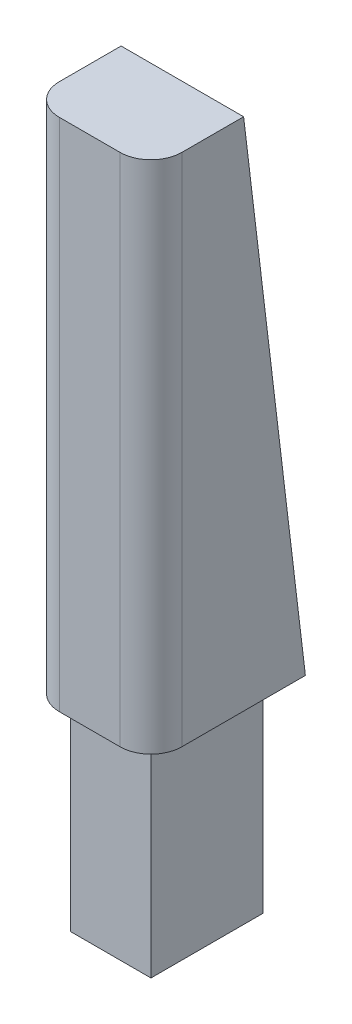
ISO-10303-21;
HEADER;
FILE_DESCRIPTION(('STEP AP214'),'2;1');
FILE_NAME('part.step','',(''),(''),'','','');
FILE_SCHEMA(('AUTOMOTIVE_DESIGN { 1 0 10303 214 1 1 1 1 }'));
ENDSEC;
DATA;
#1=APPLICATION_CONTEXT('core data for automotive mechanical design processes');
#2=APPLICATION_PROTOCOL_DEFINITION('international standard','automotive_design',2000,#1);
#3=PRODUCT_CONTEXT('',#1,'mechanical');
#4=PRODUCT('Part','Part','',(#3));
#5=PRODUCT_RELATED_PRODUCT_CATEGORY('part','',(#4));
#6=PRODUCT_DEFINITION_FORMATION('','',#4);
#7=PRODUCT_DEFINITION_CONTEXT('part definition',#1,'design');
#8=PRODUCT_DEFINITION('design','',#6,#7);
#9=PRODUCT_DEFINITION_SHAPE('','',#8);
#10=(LENGTH_UNIT() NAMED_UNIT(*) SI_UNIT(.MILLI.,.METRE.));
#11=(NAMED_UNIT(*) PLANE_ANGLE_UNIT() SI_UNIT($,.RADIAN.));
#12=(NAMED_UNIT(*) SI_UNIT($,.STERADIAN.) SOLID_ANGLE_UNIT());
#13=UNCERTAINTY_MEASURE_WITH_UNIT(LENGTH_MEASURE(1.E-05),#10,'distance_accuracy_value','');
#14=(GEOMETRIC_REPRESENTATION_CONTEXT(3) GLOBAL_UNCERTAINTY_ASSIGNED_CONTEXT((#13)) GLOBAL_UNIT_ASSIGNED_CONTEXT((#10,
#11,#12)) REPRESENTATION_CONTEXT('',''));
#15=CARTESIAN_POINT('',(0.,0.,0.));
#16=DIRECTION('',(0.,0.,1.));
#17=DIRECTION('',(1.,0.,0.));
#18=AXIS2_PLACEMENT_3D('',#15,#16,#17);
#19=CARTESIAN_POINT('',(3.9,20.,5.45));
#20=DIRECTION('',(-1.,0.,0.));
#21=DIRECTION('',(0.,0.,1.));
#22=AXIS2_PLACEMENT_3D('',#19,#20,#21);
#23=PLANE('',#22);
#24=DIRECTION('',(0.,0.,-1.));
#25=VECTOR('',#24,1.);
#26=CARTESIAN_POINT('',(3.9,0.,5.45));
#27=LINE('',#26,#25);
#28=CARTESIAN_POINT('',(3.9,0.,5.45));
#29=VERTEX_POINT('',#28);
#30=CARTESIAN_POINT('',(3.9,0.,-5.45));
#31=VERTEX_POINT('',#30);
#32=EDGE_CURVE('E162',#29,#31,#27,.T.);
#33=ORIENTED_EDGE('',*,*,#32,.T.);
#34=DIRECTION('',(0.,-1.,0.));
#35=VECTOR('',#34,1.);
#36=CARTESIAN_POINT('',(3.9,20.,-5.45));
#37=LINE('',#36,#35);
#38=CARTESIAN_POINT('',(3.9,20.,-5.45));
#39=VERTEX_POINT('',#38);
#40=EDGE_CURVE('E209',#39,#31,#37,.T.);
#41=ORIENTED_EDGE('',*,*,#40,.F.);
#42=DIRECTION('',(0.,0.,-1.));
#43=VECTOR('',#42,1.);
#44=CARTESIAN_POINT('',(3.9,20.,5.45));
#45=LINE('',#44,#43);
#46=CARTESIAN_POINT('',(3.9,20.,5.45));
#47=VERTEX_POINT('',#46);
#48=EDGE_CURVE('E169',#47,#39,#45,.T.);
#49=ORIENTED_EDGE('',*,*,#48,.F.);
#50=DIRECTION('',(0.,-1.,0.));
#51=VECTOR('',#50,1.);
#52=CARTESIAN_POINT('',(3.9,20.,5.45));
#53=LINE('',#52,#51);
#54=EDGE_CURVE('E186',#47,#29,#53,.T.);
#55=ORIENTED_EDGE('',*,*,#54,.T.);
#56=EDGE_LOOP('',(#33,#41,#49,#55));
#57=FACE_BOUND('',#56,.T.);
#58=ADVANCED_FACE('F45',(#57),#23,.F.);
#59=CARTESIAN_POINT('',(-3.9,20.,-5.45));
#60=DIRECTION('',(0.,0.,1.));
#61=DIRECTION('',(1.,0.,0.));
#62=AXIS2_PLACEMENT_3D('',#59,#60,#61);
#63=PLANE('',#62);
#64=DIRECTION('',(-1.,0.,0.));
#65=VECTOR('',#64,1.);
#66=CARTESIAN_POINT('',(-3.9,0.,-5.45));
#67=LINE('',#66,#65);
#68=CARTESIAN_POINT('',(-3.9,0.,-5.45));
#69=VERTEX_POINT('',#68);
#70=EDGE_CURVE('E190',#31,#69,#67,.T.);
#71=ORIENTED_EDGE('',*,*,#70,.T.);
#72=DIRECTION('',(0.,-1.,0.));
#73=VECTOR('',#72,1.);
#74=CARTESIAN_POINT('',(-3.9,20.,-5.45));
#75=LINE('',#74,#73);
#76=CARTESIAN_POINT('',(-3.9,20.,-5.45));
#77=VERTEX_POINT('',#76);
#78=EDGE_CURVE('E205',#77,#69,#75,.T.);
#79=ORIENTED_EDGE('',*,*,#78,.F.);
#80=DIRECTION('',(-1.,0.,0.));
#81=VECTOR('',#80,1.);
#82=CARTESIAN_POINT('',(-3.9,20.,-5.45));
#83=LINE('',#82,#81);
#84=EDGE_CURVE('E173',#39,#77,#83,.T.);
#85=ORIENTED_EDGE('',*,*,#84,.F.);
#86=ORIENTED_EDGE('',*,*,#40,.T.);
#87=EDGE_LOOP('',(#71,#79,#85,#86));
#88=FACE_BOUND('',#87,.T.);
#89=ADVANCED_FACE('F258',(#88),#63,.F.);
#90=CARTESIAN_POINT('',(-3.9,20.,5.45));
#91=DIRECTION('',(1.,0.,0.));
#92=DIRECTION('',(0.,0.,-1.));
#93=AXIS2_PLACEMENT_3D('',#90,#91,#92);
#94=PLANE('',#93);
#95=DIRECTION('',(0.,0.,1.));
#96=VECTOR('',#95,1.);
#97=CARTESIAN_POINT('',(-3.9,0.,5.45));
#98=LINE('',#97,#96);
#99=CARTESIAN_POINT('',(-3.9,0.,5.45));
#100=VERTEX_POINT('',#99);
#101=EDGE_CURVE('E193',#69,#100,#98,.T.);
#102=ORIENTED_EDGE('',*,*,#101,.T.);
#103=DIRECTION('',(0.,-1.,0.));
#104=VECTOR('',#103,1.);
#105=CARTESIAN_POINT('',(-3.9,20.,5.45));
#106=LINE('',#105,#104);
#107=CARTESIAN_POINT('',(-3.9,20.,5.45));
#108=VERTEX_POINT('',#107);
#109=EDGE_CURVE('E201',#108,#100,#106,.T.);
#110=ORIENTED_EDGE('',*,*,#109,.F.);
#111=DIRECTION('',(0.,0.,1.));
#112=VECTOR('',#111,1.);
#113=CARTESIAN_POINT('',(-3.9,20.,5.45));
#114=LINE('',#113,#112);
#115=EDGE_CURVE('E178',#77,#108,#114,.T.);
#116=ORIENTED_EDGE('',*,*,#115,.F.);
#117=ORIENTED_EDGE('',*,*,#78,.T.);
#118=EDGE_LOOP('',(#102,#110,#116,#117));
#119=FACE_BOUND('',#118,.T.);
#120=ADVANCED_FACE('F265',(#119),#94,.F.);
#121=CARTESIAN_POINT('',(-3.9,20.,5.45));
#122=DIRECTION('',(0.,0.,-1.));
#123=DIRECTION('',(-1.,0.,0.));
#124=AXIS2_PLACEMENT_3D('',#121,#122,#123);
#125=PLANE('',#124);
#126=DIRECTION('',(1.,0.,0.));
#127=VECTOR('',#126,1.);
#128=CARTESIAN_POINT('',(-3.9,0.,5.45));
#129=LINE('',#128,#127);
#130=EDGE_CURVE('E174',#100,#29,#129,.T.);
#131=ORIENTED_EDGE('',*,*,#130,.T.);
#132=ORIENTED_EDGE('',*,*,#54,.F.);
#133=DIRECTION('',(1.,0.,0.));
#134=VECTOR('',#133,1.);
#135=CARTESIAN_POINT('',(-3.9,20.,5.45));
#136=LINE('',#135,#134);
#137=EDGE_CURVE('E182',#108,#47,#136,.T.);
#138=ORIENTED_EDGE('',*,*,#137,.F.);
#139=ORIENTED_EDGE('',*,*,#109,.T.);
#140=EDGE_LOOP('',(#131,#132,#138,#139));
#141=FACE_BOUND('',#140,.T.);
#142=ADVANCED_FACE('F330',(#141),#125,.F.);
#143=CARTESIAN_POINT('',(0.,0.,0.));
#144=DIRECTION('',(0.,-1.,0.));
#145=DIRECTION('',(0.,0.,-1.));
#146=AXIS2_PLACEMENT_3D('',#143,#144,#145);
#147=PLANE('',#146);
#148=ORIENTED_EDGE('',*,*,#32,.F.);
#149=ORIENTED_EDGE('',*,*,#130,.F.);
#150=ORIENTED_EDGE('',*,*,#101,.F.);
#151=ORIENTED_EDGE('',*,*,#70,.F.);
#152=EDGE_LOOP('',(#148,#149,#150,#151));
#153=FACE_BOUND('',#152,.T.);
#154=ADVANCED_FACE('F255',(#153),#147,.T.);
#155=CARTESIAN_POINT('',(5.95,70.,7.5));
#156=DIRECTION('',(-1.,0.,0.));
#157=DIRECTION('',(0.,0.,1.));
#158=AXIS2_PLACEMENT_3D('',#155,#156,#157);
#159=PLANE('',#158);
#160=DIRECTION('',(0.,0.,-1.));
#161=VECTOR('',#160,1.);
#162=CARTESIAN_POINT('',(5.95,70.,7.5));
#163=LINE('',#162,#161);
#164=CARTESIAN_POINT('',(5.95,70.,4.5));
#165=VERTEX_POINT('',#164);
#166=CARTESIAN_POINT('',(5.95,70.,-1.5));
#167=VERTEX_POINT('',#166);
#168=EDGE_CURVE('E125',#165,#167,#163,.T.);
#169=ORIENTED_EDGE('',*,*,#168,.F.);
#170=DIRECTION('',(0.,-1.,0.));
#171=VECTOR('',#170,1.);
#172=CARTESIAN_POINT('',(5.95,70.,4.5));
#173=LINE('',#172,#171);
#174=CARTESIAN_POINT('',(5.95,20.,4.5));
#175=VERTEX_POINT('',#174);
#176=EDGE_CURVE('E213',#165,#175,#173,.T.);
#177=ORIENTED_EDGE('',*,*,#176,.T.);
#178=DIRECTION('',(0.,0.,-1.));
#179=VECTOR('',#178,1.);
#180=CARTESIAN_POINT('',(5.95,20.,7.5));
#181=LINE('',#180,#179);
#182=CARTESIAN_POINT('',(5.95,20.,-7.5));
#183=VERTEX_POINT('',#182);
#184=EDGE_CURVE('E149',#175,#183,#181,.T.);
#185=ORIENTED_EDGE('',*,*,#184,.T.);
#186=DIRECTION('',(0.,0.992876838486922,0.119145220618431));
#187=VECTOR('',#186,1.);
#188=CARTESIAN_POINT('',(5.95,20.,-7.5));
#189=LINE('',#188,#187);
#190=EDGE_CURVE('E141',#183,#167,#189,.T.);
#191=ORIENTED_EDGE('',*,*,#190,.T.);
#192=EDGE_LOOP('',(#169,#177,#185,#191));
#193=FACE_BOUND('',#192,.T.);
#194=ADVANCED_FACE('F147',(#193),#159,.F.);
#195=CARTESIAN_POINT('',(-5.95,70.,7.5));
#196=DIRECTION('',(1.,0.,0.));
#197=DIRECTION('',(0.,0.,-1.));
#198=AXIS2_PLACEMENT_3D('',#195,#196,#197);
#199=PLANE('',#198);
#200=DIRECTION('',(0.,0.,1.));
#201=VECTOR('',#200,1.);
#202=CARTESIAN_POINT('',(-5.95,20.,7.5));
#203=LINE('',#202,#201);
#204=CARTESIAN_POINT('',(-5.95,20.,-7.5));
#205=VERTEX_POINT('',#204);
#206=CARTESIAN_POINT('',(-5.95,20.,4.5));
#207=VERTEX_POINT('',#206);
#208=EDGE_CURVE('E168',#205,#207,#203,.T.);
#209=ORIENTED_EDGE('',*,*,#208,.T.);
#210=DIRECTION('',(0.,-1.,0.));
#211=VECTOR('',#210,1.);
#212=CARTESIAN_POINT('',(-5.95,70.,4.5));
#213=LINE('',#212,#211);
#214=CARTESIAN_POINT('',(-5.95,70.,4.5));
#215=VERTEX_POINT('',#214);
#216=EDGE_CURVE('E11',#207,#215,#213,.F.);
#217=ORIENTED_EDGE('',*,*,#216,.T.);
#218=DIRECTION('',(0.,0.,1.));
#219=VECTOR('',#218,1.);
#220=CARTESIAN_POINT('',(-5.95,70.,7.5));
#221=LINE('',#220,#219);
#222=CARTESIAN_POINT('',(-5.95,70.,-1.5));
#223=VERTEX_POINT('',#222);
#224=EDGE_CURVE('E135',#223,#215,#221,.T.);
#225=ORIENTED_EDGE('',*,*,#224,.F.);
#226=DIRECTION('',(0.,-0.992876838486922,-0.119145220618431));
#227=VECTOR('',#226,1.);
#228=CARTESIAN_POINT('',(-5.95,71.0646687697161,-1.37223974763407));
#229=LINE('',#228,#227);
#230=EDGE_CURVE('E144',#223,#205,#229,.T.);
#231=ORIENTED_EDGE('',*,*,#230,.T.);
#232=EDGE_LOOP('',(#209,#217,#225,#231));
#233=FACE_BOUND('',#232,.T.);
#234=ADVANCED_FACE('F247',(#233),#199,.F.);
#235=CARTESIAN_POINT('',(-5.95,70.,7.5));
#236=DIRECTION('',(0.,0.,-1.));
#237=DIRECTION('',(-1.,0.,0.));
#238=AXIS2_PLACEMENT_3D('',#235,#236,#237);
#239=PLANE('',#238);
#240=DIRECTION('',(1.,0.,0.));
#241=VECTOR('',#240,1.);
#242=CARTESIAN_POINT('',(-5.95,20.,7.5));
#243=LINE('',#242,#241);
#244=CARTESIAN_POINT('',(-2.95,20.,7.5));
#245=VERTEX_POINT('',#244);
#246=CARTESIAN_POINT('',(2.95,20.,7.5));
#247=VERTEX_POINT('',#246);
#248=EDGE_CURVE('E136',#245,#247,#243,.T.);
#249=ORIENTED_EDGE('',*,*,#248,.T.);
#250=DIRECTION('',(0.,-1.,0.));
#251=VECTOR('',#250,1.);
#252=CARTESIAN_POINT('',(2.95,70.,7.5));
#253=LINE('',#252,#251);
#254=CARTESIAN_POINT('',(2.95,70.,7.5));
#255=VERTEX_POINT('',#254);
#256=EDGE_CURVE('E67',#247,#255,#253,.F.);
#257=ORIENTED_EDGE('',*,*,#256,.T.);
#258=DIRECTION('',(1.,0.,0.));
#259=VECTOR('',#258,1.);
#260=CARTESIAN_POINT('',(-5.95,70.,7.5));
#261=LINE('',#260,#259);
#262=CARTESIAN_POINT('',(-2.95,70.,7.5));
#263=VERTEX_POINT('',#262);
#264=EDGE_CURVE('E159',#263,#255,#261,.T.);
#265=ORIENTED_EDGE('',*,*,#264,.F.);
#266=DIRECTION('',(0.,-1.,0.));
#267=VECTOR('',#266,1.);
#268=CARTESIAN_POINT('',(-2.95,70.,7.5));
#269=LINE('',#268,#267);
#270=EDGE_CURVE('E230',#263,#245,#269,.T.);
#271=ORIENTED_EDGE('',*,*,#270,.T.);
#272=EDGE_LOOP('',(#249,#257,#265,#271));
#273=FACE_BOUND('',#272,.T.);
#274=ADVANCED_FACE('F242',(#273),#239,.F.);
#275=CARTESIAN_POINT('',(0.,70.,0.));
#276=DIRECTION('',(0.,-1.,0.));
#277=DIRECTION('',(0.,0.,-1.));
#278=AXIS2_PLACEMENT_3D('',#275,#276,#277);
#279=PLANE('',#278);
#280=ORIENTED_EDGE('',*,*,#264,.T.);
#281=CARTESIAN_POINT('',(2.95,70.,4.5));
#282=DIRECTION('',(0.,-1.,0.));
#283=DIRECTION('',(0.,0.,-1.));
#284=AXIS2_PLACEMENT_3D('',#281,#282,#283);
#285=CIRCLE('',#284,3.);
#286=EDGE_CURVE('E54',#255,#165,#285,.F.);
#287=ORIENTED_EDGE('',*,*,#286,.T.);
#288=ORIENTED_EDGE('',*,*,#168,.T.);
#289=DIRECTION('',(-1.,0.,0.));
#290=VECTOR('',#289,1.);
#291=CARTESIAN_POINT('',(5.95,70.,-1.5));
#292=LINE('',#291,#290);
#293=EDGE_CURVE('E128',#167,#223,#292,.T.);
#294=ORIENTED_EDGE('',*,*,#293,.T.);
#295=ORIENTED_EDGE('',*,*,#224,.T.);
#296=CARTESIAN_POINT('',(-2.95,70.,4.5));
#297=DIRECTION('',(0.,-1.,0.));
#298=DIRECTION('',(0.,0.,-1.));
#299=AXIS2_PLACEMENT_3D('',#296,#297,#298);
#300=CIRCLE('',#299,3.);
#301=EDGE_CURVE('E236',#215,#263,#300,.F.);
#302=ORIENTED_EDGE('',*,*,#301,.T.);
#303=EDGE_LOOP('',(#280,#287,#288,#294,#295,#302));
#304=FACE_BOUND('',#303,.T.);
#305=ADVANCED_FACE('F127',(#304),#279,.F.);
#306=CARTESIAN_POINT('',(0.,20.,0.));
#307=DIRECTION('',(0.,-1.,0.));
#308=DIRECTION('',(0.,0.,-1.));
#309=AXIS2_PLACEMENT_3D('',#306,#307,#308);
#310=PLANE('',#309);
#311=ORIENTED_EDGE('',*,*,#137,.T.);
#312=ORIENTED_EDGE('',*,*,#48,.T.);
#313=ORIENTED_EDGE('',*,*,#84,.T.);
#314=ORIENTED_EDGE('',*,*,#115,.T.);
#315=EDGE_LOOP('',(#311,#312,#313,#314));
#316=FACE_BOUND('',#315,.T.);
#317=ORIENTED_EDGE('',*,*,#184,.F.);
#318=CARTESIAN_POINT('',(2.95,20.,4.5));
#319=DIRECTION('',(0.,-1.,0.));
#320=DIRECTION('',(0.,0.,-1.));
#321=AXIS2_PLACEMENT_3D('',#318,#319,#320);
#322=CIRCLE('',#321,3.);
#323=EDGE_CURVE('E227',#175,#247,#322,.T.);
#324=ORIENTED_EDGE('',*,*,#323,.T.);
#325=ORIENTED_EDGE('',*,*,#248,.F.);
#326=CARTESIAN_POINT('',(-2.95,20.,4.5));
#327=DIRECTION('',(0.,-1.,0.));
#328=DIRECTION('',(0.,0.,-1.));
#329=AXIS2_PLACEMENT_3D('',#326,#327,#328);
#330=CIRCLE('',#329,3.);
#331=EDGE_CURVE('E224',#245,#207,#330,.T.);
#332=ORIENTED_EDGE('',*,*,#331,.T.);
#333=ORIENTED_EDGE('',*,*,#208,.F.);
#334=DIRECTION('',(-1.,0.,0.));
#335=VECTOR('',#334,1.);
#336=CARTESIAN_POINT('',(-5.95,20.,-7.5));
#337=LINE('',#336,#335);
#338=EDGE_CURVE('E165',#183,#205,#337,.T.);
#339=ORIENTED_EDGE('',*,*,#338,.F.);
#340=EDGE_LOOP('',(#317,#324,#325,#332,#333,#339));
#341=FACE_BOUND('',#340,.T.);
#342=ADVANCED_FACE('F246',(#316,#341),#310,.T.);
#343=CARTESIAN_POINT('',(5.95,20.,-7.5));
#344=DIRECTION('',(0.,-0.119145220618431,0.992876838486922));
#345=DIRECTION('',(0.,-0.992876838486922,-0.119145220618431));
#346=AXIS2_PLACEMENT_3D('',#343,#344,#345);
#347=PLANE('',#346);
#348=ORIENTED_EDGE('',*,*,#293,.F.);
#349=ORIENTED_EDGE('',*,*,#190,.F.);
#350=ORIENTED_EDGE('',*,*,#338,.T.);
#351=ORIENTED_EDGE('',*,*,#230,.F.);
#352=EDGE_LOOP('',(#348,#349,#350,#351));
#353=FACE_BOUND('',#352,.T.);
#354=ADVANCED_FACE('F140',(#353),#347,.F.);
#355=CARTESIAN_POINT('',(2.95,70.,4.5));
#356=DIRECTION('',(0.,-1.,0.));
#357=DIRECTION('',(0.,0.,-1.));
#358=AXIS2_PLACEMENT_3D('',#355,#356,#357);
#359=CYLINDRICAL_SURFACE('',#358,3.);
#360=ORIENTED_EDGE('',*,*,#286,.F.);
#361=ORIENTED_EDGE('',*,*,#256,.F.);
#362=ORIENTED_EDGE('',*,*,#323,.F.);
#363=ORIENTED_EDGE('',*,*,#176,.F.);
#364=EDGE_LOOP('',(#360,#361,#362,#363));
#365=FACE_BOUND('',#364,.T.);
#366=ADVANCED_FACE('F269',(#365),#359,.T.);
#367=CARTESIAN_POINT('',(-2.95,70.,4.5));
#368=DIRECTION('',(0.,-1.,0.));
#369=DIRECTION('',(0.,0.,-1.));
#370=AXIS2_PLACEMENT_3D('',#367,#368,#369);
#371=CYLINDRICAL_SURFACE('',#370,3.);
#372=ORIENTED_EDGE('',*,*,#301,.F.);
#373=ORIENTED_EDGE('',*,*,#216,.F.);
#374=ORIENTED_EDGE('',*,*,#331,.F.);
#375=ORIENTED_EDGE('',*,*,#270,.F.);
#376=EDGE_LOOP('',(#372,#373,#374,#375));
#377=FACE_BOUND('',#376,.T.);
#378=ADVANCED_FACE('F47',(#377),#371,.T.);
#379=CLOSED_SHELL('',(#58,#89,#120,#142,#154,#194,#234,#274,#305,#342,#354,#366,#378));
#380=MANIFOLD_SOLID_BREP('B2',#379);
#381=ADVANCED_BREP_SHAPE_REPRESENTATION('',(#18,#380),#14);
#382=SHAPE_DEFINITION_REPRESENTATION(#9,#381);
ENDSEC;
END-ISO-10303-21;
